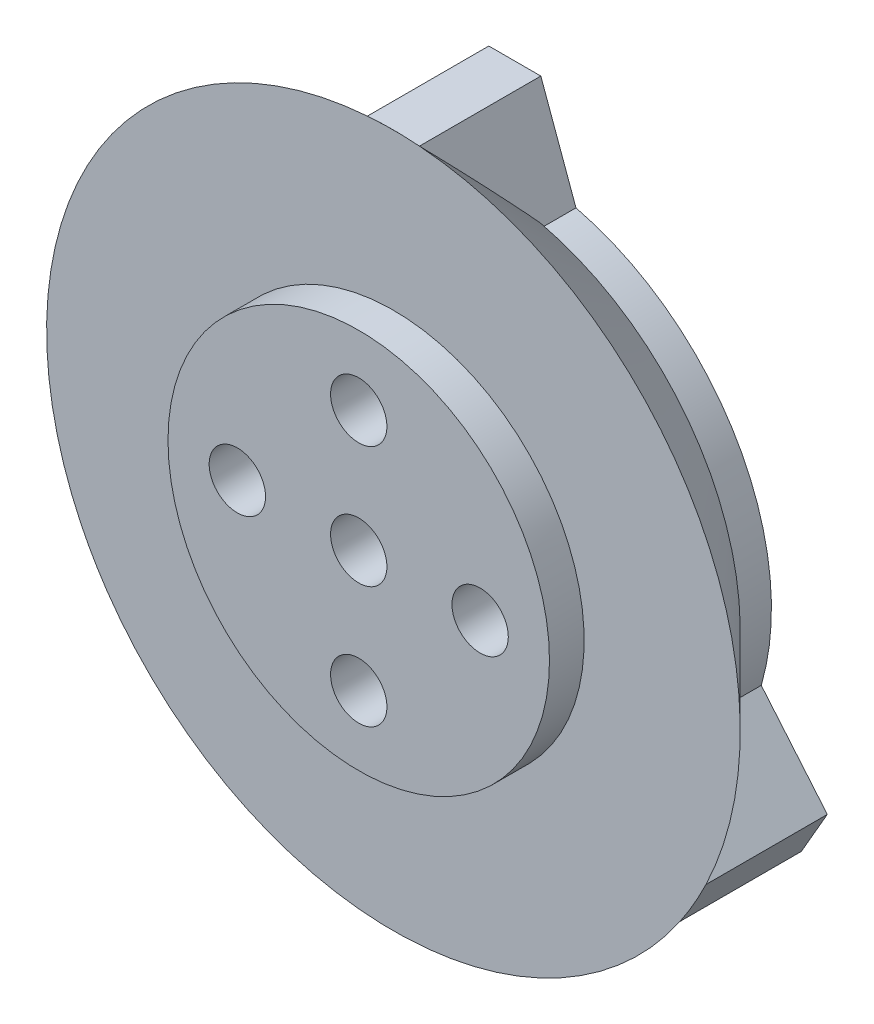
ISO-10303-21;
HEADER;
FILE_DESCRIPTION(('STEP AP214'),'2;1');
FILE_NAME('part.step','',(''),(''),'','','');
FILE_SCHEMA(('AUTOMOTIVE_DESIGN { 1 0 10303 214 1 1 1 1 }'));
ENDSEC;
DATA;
#1=APPLICATION_CONTEXT('core data for automotive mechanical design processes');
#2=APPLICATION_PROTOCOL_DEFINITION('international standard','automotive_design',2000,#1);
#3=PRODUCT_CONTEXT('',#1,'mechanical');
#4=PRODUCT('Part','Part','',(#3));
#5=PRODUCT_RELATED_PRODUCT_CATEGORY('part','',(#4));
#6=PRODUCT_DEFINITION_FORMATION('','',#4);
#7=PRODUCT_DEFINITION_CONTEXT('part definition',#1,'design');
#8=PRODUCT_DEFINITION('design','',#6,#7);
#9=PRODUCT_DEFINITION_SHAPE('','',#8);
#10=(LENGTH_UNIT() NAMED_UNIT(*) SI_UNIT(.MILLI.,.METRE.));
#11=(NAMED_UNIT(*) PLANE_ANGLE_UNIT() SI_UNIT($,.RADIAN.));
#12=(NAMED_UNIT(*) SI_UNIT($,.STERADIAN.) SOLID_ANGLE_UNIT());
#13=UNCERTAINTY_MEASURE_WITH_UNIT(LENGTH_MEASURE(1.E-05),#10,'distance_accuracy_value','');
#14=(GEOMETRIC_REPRESENTATION_CONTEXT(3) GLOBAL_UNCERTAINTY_ASSIGNED_CONTEXT((#13)) GLOBAL_UNIT_ASSIGNED_CONTEXT((#10,
#11,#12)) REPRESENTATION_CONTEXT('',''));
#15=CARTESIAN_POINT('',(0.,0.,0.));
#16=DIRECTION('',(0.,0.,1.));
#17=DIRECTION('',(1.,0.,0.));
#18=AXIS2_PLACEMENT_3D('',#15,#16,#17);
#19=CARTESIAN_POINT('',(0.,0.,-5.));
#20=DIRECTION('',(0.,0.,1.));
#21=DIRECTION('',(1.,0.,0.));
#22=AXIS2_PLACEMENT_3D('',#19,#20,#21);
#23=CONICAL_SURFACE('',#22,15.,0.785398163397448);
#24=CARTESIAN_POINT('',(0.,0.,0.));
#25=DIRECTION('',(0.,0.,1.));
#26=DIRECTION('',(1.,0.,0.));
#27=AXIS2_PLACEMENT_3D('',#24,#25,#26);
#28=CIRCLE('',#27,20.);
#29=CARTESIAN_POINT('',(-16.5217254494158,-11.2708734432663,0.));
#30=VERTEX_POINT('',#29);
#31=CARTESIAN_POINT('',(16.521725449416,-11.2708734432661,0.));
#32=VERTEX_POINT('',#31);
#33=EDGE_CURVE('E360',#30,#32,#28,.T.);
#34=ORIENTED_EDGE('',*,*,#33,.F.);
#35=CARTESIAN_POINT('',(-16.5219254494158,-11.2709087086624,0.000185091019962331));
#36=CARTESIAN_POINT('',(-16.2922122032231,-11.2304040655325,-0.212401544037627));
#37=CARTESIAN_POINT('',(-16.062163106996,-11.1898402029801,-0.424614067599164));
#38=CARTESIAN_POINT('',(-15.6013123203344,-11.1085797752109,-0.848196392483601));
#39=CARTESIAN_POINT('',(-15.3705106272494,-11.0678832095269,-1.05956619083268));
#40=CARTESIAN_POINT('',(-14.6769098007634,-10.9455826699757,-1.69222002010012));
#41=CARTESIAN_POINT('',(-14.2128632374091,-10.8637587405513,-2.11209639089741));
#42=CARTESIAN_POINT('',(-13.2806026089994,-10.6993760387104,-2.94710445182855));
#43=CARTESIAN_POINT('',(-12.8123883608847,-10.6168172340157,-3.36223593170281));
#44=CARTESIAN_POINT('',(-12.1060921392238,-10.4922781537644,-3.98030263401681));
#45=CARTESIAN_POINT('',(-11.8699845105145,-10.4506460084718,-4.1855642641485));
#46=CARTESIAN_POINT('',(-11.3962612034901,-10.367115808053,-4.59429165106725));
#47=CARTESIAN_POINT('',(-11.15864550378,-10.3252177491542,-4.79775738227759));
#48=CARTESIAN_POINT('',(-10.9201834047527,-10.2831704472193,-5.00019999999999));
#49=B_SPLINE_CURVE_WITH_KNOTS('',3,(#35,#36,#37,#38,#39,#40,#41,#42,#43,#44,#45,#46,#47,#48),
.UNSPECIFIED.,.F.,.F.,(4,2,2,2,2,2,4),(0.,0.946792412462713,1.8935881630313,3.78696649870036,
5.68042841256464,6.62726340502184,7.57411186036455),.UNSPECIFIED.);
#50=CARTESIAN_POINT('',(-10.9204190020951,-10.2832119893873,-5.));
#51=VERTEX_POINT('',#50);
#52=EDGE_CURVE('E167',#30,#51,#49,.T.);
#53=ORIENTED_EDGE('',*,*,#52,.T.);
#54=CARTESIAN_POINT('',(0.,0.,-5.));
#55=DIRECTION('',(0.,0.,1.));
#56=DIRECTION('',(1.,0.,0.));
#57=AXIS2_PLACEMENT_3D('',#54,#55,#56);
#58=CIRCLE('',#57,15.);
#59=CARTESIAN_POINT('',(10.9204190020953,-10.2832119893872,-5.));
#60=VERTEX_POINT('',#59);
#61=EDGE_CURVE('E329',#51,#60,#58,.T.);
#62=ORIENTED_EDGE('',*,*,#61,.T.);
#63=CARTESIAN_POINT('',(10.9201834047528,-10.2831704472191,-5.00019999999999));
#64=CARTESIAN_POINT('',(11.1586455037802,-10.325217749154,-4.79775738227759));
#65=CARTESIAN_POINT('',(11.3962612034902,-10.3671158080528,-4.59429165106725));
#66=CARTESIAN_POINT('',(11.8699845105146,-10.4506460084717,-4.1855642641485));
#67=CARTESIAN_POINT('',(12.1060921392239,-10.4922781537642,-3.98030263401681));
#68=CARTESIAN_POINT('',(12.8123883608849,-10.6168172340155,-3.36223593170282));
#69=CARTESIAN_POINT('',(13.2806026089995,-10.6993760387102,-2.94710445182855));
#70=CARTESIAN_POINT('',(14.2128632374093,-10.8637587405511,-2.11209639089742));
#71=CARTESIAN_POINT('',(14.6769098007636,-10.9455826699755,-1.69222002010012));
#72=CARTESIAN_POINT('',(15.3705106272495,-11.0678832095266,-1.05956619083268));
#73=CARTESIAN_POINT('',(15.6013123203346,-11.1085797752107,-0.848196392483602));
#74=CARTESIAN_POINT('',(16.0621631069962,-11.1898402029799,-0.424614067599166));
#75=CARTESIAN_POINT('',(16.2922122032232,-11.2304040655323,-0.21240154403763));
#76=CARTESIAN_POINT('',(16.521925449416,-11.2709087086622,0.000185091019959094));
#77=B_SPLINE_CURVE_WITH_KNOTS('',3,(#63,#64,#65,#66,#67,#68,#69,#70,#71,#72,#73,#74,#75,#76),
.UNSPECIFIED.,.F.,.F.,(4,2,2,2,2,2,4),(0.,0.946848455342708,1.8936834477999,3.78714536166419,
5.68052369733325,6.62731944790183,7.57411186036454),.UNSPECIFIED.);
#78=EDGE_CURVE('E57',#60,#32,#77,.T.);
#79=ORIENTED_EDGE('',*,*,#78,.T.);
#80=EDGE_LOOP('',(#34,#53,#62,#79));
#81=FACE_BOUND('',#80,.T.);
#82=ADVANCED_FACE('F41',(#81),#23,.T.);
#83=CARTESIAN_POINT('',(-18.0217254494158,-8.67279723191299,0.));
#84=VERTEX_POINT('',#83);
#85=EDGE_CURVE('E356',#84,#30,#28,.T.);
#86=ORIENTED_EDGE('',*,*,#85,.F.);
#87=CARTESIAN_POINT('',(-18.0218409194697,-8.67259723191299,1.73218339113585E-05));
#88=CARTESIAN_POINT('',(-17.7718024294517,-9.10567660047188,-0.0375471092692742));
#89=CARTESIAN_POINT('',(-17.5217639394338,-9.53875596903076,-0.0563293248208667));
#90=CARTESIAN_POINT('',(-17.0216869593979,-10.4049147061485,-0.056329324820866));
#91=CARTESIAN_POINT('',(-16.7716484693799,-10.8379940747074,-0.0375471092692727));
#92=CARTESIAN_POINT('',(-16.521609979362,-11.2710734432663,1.73218339134339E-05));
#93=B_SPLINE_CURVE_WITH_KNOTS('',3,(#87,#88,#89,#90,#91,#92),.UNSPECIFIED.,.F.,.F.,(4,2,4),(0.,
1.50128871914952,3.00257743829904),.UNSPECIFIED.);
#94=EDGE_CURVE('E47',#84,#30,#93,.T.);
#95=ORIENTED_EDGE('',*,*,#94,.T.);
#96=EDGE_LOOP('',(#86,#95));
#97=FACE_BOUND('',#96,.T.);
#98=ADVANCED_FACE('F353',(#97),#23,.T.);
#99=CARTESIAN_POINT('',(18.021725449416,-8.67279723191274,0.));
#100=VERTEX_POINT('',#99);
#101=CARTESIAN_POINT('',(1.5,19.9436706751791,0.));
#102=VERTEX_POINT('',#101);
#103=EDGE_CURVE('E328',#100,#102,#28,.T.);
#104=ORIENTED_EDGE('',*,*,#103,.F.);
#105=CARTESIAN_POINT('',(18.0218665051182,-8.67296533555267,0.0002));
#106=CARTESIAN_POINT('',(17.8719314042926,-8.4942796404878,-0.212387273925661));
#107=CARTESIAN_POINT('',(17.7217770921702,-8.31533269957234,-0.424600435124053));
#108=CARTESIAN_POINT('',(17.4209772451158,-7.95685340119349,-0.848184032275198));
#109=CARTESIAN_POINT('',(17.2703317084538,-7.77732104166831,-1.05955446525411));
#110=CARTESIAN_POINT('',(16.8176146268937,-7.23779383329031,-1.69221019277282));
#111=CARTESIAN_POINT('',(16.5147288767135,-6.87682865236753,-2.11208782185404));
#112=CARTESIAN_POINT('',(15.9062372205989,-6.15165653512935,-2.9470983788562));
#113=CARTESIAN_POINT('',(15.6006311951799,-5.78744945641774,-3.36223109651545));
#114=CARTESIAN_POINT('',(15.1396277450708,-5.23804693855198,-3.98029963232471));
#115=CARTESIAN_POINT('',(14.9855189890152,-5.05438727487253,-4.1855618698266));
#116=CARTESIAN_POINT('',(14.6763171620254,-4.68589488672068,-4.59429046173134));
#117=CARTESIAN_POINT('',(14.5212240771263,-4.50106214560574,-4.79775679055716));
#118=CARTESIAN_POINT('',(14.3655785411136,-4.31557101889136,-5.0002));
#119=B_SPLINE_CURVE_WITH_KNOTS('',3,(#105,#106,#107,#108,#109,#110,#111,#112,#113,#114,#115,
#116,#117,#118),.UNSPECIFIED.,.F.,.F.,(4,2,2,2,2,2,4),(0.,0.946795179202998,1.89359369653109,
3.78697756439935,5.68044501119241,6.62728277075473,7.57413399333534),.UNSPECIFIED.);
#120=CARTESIAN_POINT('',(14.3657323163577,-4.31575428109096,-5.));
#121=VERTEX_POINT('',#120);
#122=EDGE_CURVE('E232',#100,#121,#119,.T.);
#123=ORIENTED_EDGE('',*,*,#122,.T.);
#124=CARTESIAN_POINT('',(3.44531331426252,14.5989662704784,-5.));
#125=VERTEX_POINT('',#124);
#126=EDGE_CURVE('E317',#121,#125,#58,.T.);
#127=ORIENTED_EDGE('',*,*,#126,.T.);
#128=CARTESIAN_POINT('',(3.44539513636088,14.5987414661107,-5.0002));
#129=CARTESIAN_POINT('',(3.36257797422576,14.8262797490203,-4.79775702958947));
#130=CARTESIAN_POINT('',(3.28005476450179,15.0530104043178,-4.59429094217734));
#131=CARTESIAN_POINT('',(3.11553210176056,15.5050327051879,-4.18556283704062));
#132=CARTESIAN_POINT('',(3.03353264131286,15.7303243711754,-3.98030084489295));
#133=CARTESIAN_POINT('',(2.78823811530083,16.4042655425093,-3.36223304974531));
#134=CARTESIAN_POINT('',(2.62562873458413,16.8510311442199,-2.94710083210363));
#135=CARTESIAN_POINT('',(2.30185746232543,17.7405854038188,-2.11209128341824));
#136=CARTESIAN_POINT('',(2.14069550720726,18.1833742363811,-1.69221416263537));
#137=CARTESIAN_POINT('',(1.89981005767226,18.8452015696537,-1.05955920193722));
#138=CARTESIAN_POINT('',(1.81965333436264,19.0654303569644,-0.848189025324378));
#139=CARTESIAN_POINT('',(1.65960126338927,19.5051698079007,-0.424605942120091));
#140=CARTESIAN_POINT('',(1.57970591480499,19.7246804740555,-0.212393038502483));
#141=CARTESIAN_POINT('',(1.49992720595315,19.9438706751791,0.000193977345028846));
#142=B_SPLINE_CURVE_WITH_KNOTS('',3,(#128,#129,#130,#131,#132,#133,#134,#135,#136,#137,#138,
#139,#140,#141),.UNSPECIFIED.,.F.,.F.,(4,2,2,2,2,2,4),(0.,0.94685010472287,1.89368674648109,
3.78715195818361,5.68053359125606,6.62733099091967,7.57412505246595),.UNSPECIFIED.);
#143=EDGE_CURVE('E287',#125,#102,#142,.T.);
#144=ORIENTED_EDGE('',*,*,#143,.T.);
#145=EDGE_LOOP('',(#104,#123,#127,#144));
#146=FACE_BOUND('',#145,.T.);
#147=ADVANCED_FACE('F409',(#146),#23,.T.);
#148=EDGE_CURVE('E368',#32,#100,#28,.T.);
#149=ORIENTED_EDGE('',*,*,#148,.F.);
#150=CARTESIAN_POINT('',(16.5216099793621,-11.2710734432661,1.73218339080578E-05));
#151=CARTESIAN_POINT('',(16.7716484693801,-10.8379940747072,-0.0375471092692766));
#152=CARTESIAN_POINT('',(17.021686959398,-10.4049147061483,-0.056329324820869));
#153=CARTESIAN_POINT('',(17.5217639394339,-9.53875596903052,-0.0563293248208692));
#154=CARTESIAN_POINT('',(17.7718024294519,-9.10567660047163,-0.037547109269277));
#155=CARTESIAN_POINT('',(18.0218409194698,-8.67259723191274,1.73218339075068E-05));
#156=B_SPLINE_CURVE_WITH_KNOTS('',3,(#150,#151,#152,#153,#154,#155),.UNSPECIFIED.,.F.,.F.,(4,2,
4),(0.,1.50128871914952,3.00257743829903),.UNSPECIFIED.);
#157=EDGE_CURVE('E341',#32,#100,#156,.T.);
#158=ORIENTED_EDGE('',*,*,#157,.T.);
#159=EDGE_LOOP('',(#149,#158));
#160=FACE_BOUND('',#159,.T.);
#161=ADVANCED_FACE('F415',(#160),#23,.T.);
#162=CARTESIAN_POINT('',(0.,0.,-7.));
#163=DIRECTION('',(0.,0.,1.));
#164=DIRECTION('',(1.,0.,0.));
#165=AXIS2_PLACEMENT_3D('',#162,#163,#164);
#166=CYLINDRICAL_SURFACE('',#165,14.8);
#167=DIRECTION('',(0.,0.,1.));
#168=VECTOR('',#167,1.);
#169=CARTESIAN_POINT('',(-10.6841325424947,-10.2415483113837,-17.2374025664844));
#170=LINE('',#169,#168);
#171=CARTESIAN_POINT('',(-10.6841325424947,-10.2415483113837,-7.));
#172=VERTEX_POINT('',#171);
#173=CARTESIAN_POINT('',(-10.6841325424947,-10.2415483113837,-5.));
#174=VERTEX_POINT('',#173);
#175=EDGE_CURVE('E159',#172,#174,#170,.T.);
#176=ORIENTED_EDGE('',*,*,#175,.F.);
#177=CARTESIAN_POINT('',(0.,0.,-7.));
#178=DIRECTION('',(0.,0.,-1.));
#179=DIRECTION('',(-1.,0.,0.));
#180=AXIS2_PLACEMENT_3D('',#177,#178,#179);
#181=CIRCLE('',#180,14.8);
#182=CARTESIAN_POINT('',(10.6841325424948,-10.2415483113835,-7.));
#183=VERTEX_POINT('',#182);
#184=EDGE_CURVE('E160',#183,#172,#181,.T.);
#185=ORIENTED_EDGE('',*,*,#184,.F.);
#186=DIRECTION('',(0.,0.,1.));
#187=VECTOR('',#186,1.);
#188=CARTESIAN_POINT('',(10.6841325424948,-10.2415483113835,-17.2374025664844));
#189=LINE('',#188,#187);
#190=CARTESIAN_POINT('',(10.6841325424948,-10.2415483113835,-5.));
#191=VERTEX_POINT('',#190);
#192=EDGE_CURVE('E198',#183,#191,#189,.T.);
#193=ORIENTED_EDGE('',*,*,#192,.T.);
#194=CARTESIAN_POINT('',(0.,0.,-5.));
#195=DIRECTION('',(0.,0.,-1.));
#196=DIRECTION('',(-1.,0.,0.));
#197=AXIS2_PLACEMENT_3D('',#194,#195,#196);
#198=CIRCLE('',#197,14.8);
#199=EDGE_CURVE('E322',#191,#174,#198,.T.);
#200=ORIENTED_EDGE('',*,*,#199,.T.);
#201=EDGE_LOOP('',(#176,#185,#193,#200));
#202=FACE_BOUND('',#201,.T.);
#203=ADVANCED_FACE('F398',(#202),#166,.T.);
#204=DIRECTION('',(0.,0.,1.));
#205=VECTOR('',#204,1.);
#206=CARTESIAN_POINT('',(14.2115072829913,-4.1319560435085,-17.2374025664844));
#207=LINE('',#206,#205);
#208=CARTESIAN_POINT('',(14.2115072829913,-4.1319560435085,-7.));
#209=VERTEX_POINT('',#208);
#210=CARTESIAN_POINT('',(14.2115072829913,-4.1319560435085,-5.));
#211=VERTEX_POINT('',#210);
#212=EDGE_CURVE('E200',#209,#211,#207,.T.);
#213=ORIENTED_EDGE('',*,*,#212,.F.);
#214=CARTESIAN_POINT('',(3.5273747404965,14.3735043548923,-7.));
#215=VERTEX_POINT('',#214);
#216=EDGE_CURVE('E320',#215,#209,#181,.T.);
#217=ORIENTED_EDGE('',*,*,#216,.F.);
#218=DIRECTION('',(0.,0.,1.));
#219=VECTOR('',#218,1.);
#220=CARTESIAN_POINT('',(3.5273747404965,14.3735043548923,-15.9886730430709));
#221=LINE('',#220,#219);
#222=CARTESIAN_POINT('',(3.5273747404965,14.3735043548923,-5.));
#223=VERTEX_POINT('',#222);
#224=EDGE_CURVE('E271',#215,#223,#221,.T.);
#225=ORIENTED_EDGE('',*,*,#224,.T.);
#226=EDGE_CURVE('E319',#223,#211,#198,.T.);
#227=ORIENTED_EDGE('',*,*,#226,.T.);
#228=EDGE_LOOP('',(#213,#217,#225,#227));
#229=FACE_BOUND('',#228,.T.);
#230=ADVANCED_FACE('F394',(#229),#166,.T.);
#231=CARTESIAN_POINT('',(0.,15.,-5.));
#232=DIRECTION('',(0.,0.,1.));
#233=DIRECTION('',(1.,0.,0.));
#234=AXIS2_PLACEMENT_3D('',#231,#232,#233);
#235=PLANE('',#234);
#236=ORIENTED_EDGE('',*,*,#61,.F.);
#237=DIRECTION('',(0.984807753012207,0.173648177666938,0.));
#238=VECTOR('',#237,1.);
#239=CARTESIAN_POINT('',(3.99439296920386,-7.6533282266536,-5.));
#240=LINE('',#239,#238);
#241=EDGE_CURVE('E247',#51,#174,#240,.T.);
#242=ORIENTED_EDGE('',*,*,#241,.T.);
#243=ORIENTED_EDGE('',*,*,#199,.F.);
#244=DIRECTION('',(0.984807753012209,-0.173648177666924,0.));
#245=VECTOR('',#244,1.);
#246=CARTESIAN_POINT('',(-3.99439296920355,-7.65332822665369,-5.));
#247=LINE('',#246,#245);
#248=EDGE_CURVE('E190',#191,#60,#247,.T.);
#249=ORIENTED_EDGE('',*,*,#248,.T.);
#250=EDGE_LOOP('',(#236,#242,#243,#249));
#251=FACE_BOUND('',#250,.T.);
#252=ADVANCED_FACE('F405',(#251),#235,.F.);
#253=ORIENTED_EDGE('',*,*,#126,.F.);
#254=DIRECTION('',(-0.642787609686549,0.76604444311897,0.));
#255=VECTOR('',#254,1.);
#256=CARTESIAN_POINT('',(-1.08099450867669,14.0929379064647,-5.));
#257=LINE('',#256,#255);
#258=EDGE_CURVE('E215',#121,#211,#257,.T.);
#259=ORIENTED_EDGE('',*,*,#258,.T.);
#260=ORIENTED_EDGE('',*,*,#226,.F.);
#261=DIRECTION('',(-0.342020143325666,0.93969262078591,0.));
#262=VECTOR('',#261,1.);
#263=CARTESIAN_POINT('',(2.91339846052714,16.0603903201888,-5.));
#264=LINE('',#263,#262);
#265=EDGE_CURVE('E283',#223,#125,#264,.T.);
#266=ORIENTED_EDGE('',*,*,#265,.T.);
#267=EDGE_LOOP('',(#253,#259,#260,#266));
#268=FACE_BOUND('',#267,.T.);
#269=ADVANCED_FACE('F408',(#268),#235,.F.);
#270=CARTESIAN_POINT('',(-3.44531331426252,14.5989662704784,-5.));
#271=VERTEX_POINT('',#270);
#272=CARTESIAN_POINT('',(-14.3657323163577,-4.31575428109116,-5.));
#273=VERTEX_POINT('',#272);
#274=EDGE_CURVE('E326',#271,#273,#58,.T.);
#275=ORIENTED_EDGE('',*,*,#274,.T.);
#276=CARTESIAN_POINT('',(-14.3655785411136,-4.31557101889156,-5.0002));
#277=CARTESIAN_POINT('',(-14.5212240771263,-4.50106214560594,-4.79775679055716));
#278=CARTESIAN_POINT('',(-14.6763171620253,-4.68589488672088,-4.59429046173134));
#279=CARTESIAN_POINT('',(-14.9855189890152,-5.05438727487274,-4.1855618698266));
#280=CARTESIAN_POINT('',(-15.1396277450707,-5.23804693855218,-3.98029963232471));
#281=CARTESIAN_POINT('',(-15.6006311951798,-5.78744945641795,-3.36223109651545));
#282=CARTESIAN_POINT('',(-15.9062372205988,-6.15165653512956,-2.9470983788562));
#283=CARTESIAN_POINT('',(-16.5147288767134,-6.87682865236775,-2.11208782185404));
#284=CARTESIAN_POINT('',(-16.8176146268936,-7.23779383329054,-1.69221019277282));
#285=CARTESIAN_POINT('',(-17.2703317084537,-7.77732104166855,-1.05955446525411));
#286=CARTESIAN_POINT('',(-17.4209772451157,-7.95685340119373,-0.848184032275199));
#287=CARTESIAN_POINT('',(-17.7217770921701,-8.31533269957259,-0.424600435124056));
#288=CARTESIAN_POINT('',(-17.8719314042925,-8.49427964048805,-0.212387273925664));
#289=CARTESIAN_POINT('',(-18.0218665051181,-8.67296533555291,0.000199999999999724));
#290=B_SPLINE_CURVE_WITH_KNOTS('',3,(#276,#277,#278,#279,#280,#281,#282,#283,#284,#285,#286,
#287,#288,#289),.UNSPECIFIED.,.F.,.F.,(4,2,2,2,2,2,4),(0.,0.946851222580607,1.89368898214293,
3.78715642893598,5.68054029680424,6.62733881413233,7.57413399333533),.UNSPECIFIED.);
#291=EDGE_CURVE('E63',#273,#84,#290,.T.);
#292=ORIENTED_EDGE('',*,*,#291,.T.);
#293=CARTESIAN_POINT('',(-1.5,19.9436706751791,0.));
#294=VERTEX_POINT('',#293);
#295=EDGE_CURVE('E331',#294,#84,#28,.T.);
#296=ORIENTED_EDGE('',*,*,#295,.F.);
#297=CARTESIAN_POINT('',(-1.49992720595315,19.9438706751791,0.000193977345030234));
#298=CARTESIAN_POINT('',(-1.57970591480499,19.7246804740555,-0.212393038502483));
#299=CARTESIAN_POINT('',(-1.65960126338927,19.5051698079007,-0.424605942120089));
#300=CARTESIAN_POINT('',(-1.81965333436264,19.0654303569644,-0.848189025324375));
#301=CARTESIAN_POINT('',(-1.89981005767226,18.8452015696537,-1.05955920193722));
#302=CARTESIAN_POINT('',(-2.14069550720726,18.1833742363811,-1.69221416263537));
#303=CARTESIAN_POINT('',(-2.30185746232543,17.7405854038188,-2.11209128341823));
#304=CARTESIAN_POINT('',(-2.62562873458413,16.8510311442199,-2.94710083210363));
#305=CARTESIAN_POINT('',(-2.78823811530083,16.4042655425093,-3.36223304974531));
#306=CARTESIAN_POINT('',(-3.03353264131286,15.7303243711754,-3.98030084489294));
#307=CARTESIAN_POINT('',(-3.11553210176056,15.5050327051879,-4.18556283704062));
#308=CARTESIAN_POINT('',(-3.28005476450179,15.0530104043178,-4.59429094217734));
#309=CARTESIAN_POINT('',(-3.36257797422576,14.8262797490203,-4.79775702958947));
#310=CARTESIAN_POINT('',(-3.44539513636088,14.5987414661107,-5.0002));
#311=B_SPLINE_CURVE_WITH_KNOTS('',3,(#297,#298,#299,#300,#301,#302,#303,#304,#305,#306,#307,
#308,#309,#310),.UNSPECIFIED.,.F.,.F.,(4,2,2,2,2,2,4),(0.,0.946794061546281,1.89359146120989,
3.78697309428233,5.68043830598486,6.62727494774308,7.57412505246595),.UNSPECIFIED.);
#312=EDGE_CURVE('E310',#294,#271,#311,.T.);
#313=ORIENTED_EDGE('',*,*,#312,.T.);
#314=EDGE_LOOP('',(#275,#292,#296,#313));
#315=FACE_BOUND('',#314,.T.);
#316=ADVANCED_FACE('F367',(#315),#23,.T.);
#317=CARTESIAN_POINT('',(-14.2115072829912,-4.1319560435087,-7.));
#318=VERTEX_POINT('',#317);
#319=CARTESIAN_POINT('',(-3.5273747404965,14.3735043548923,-7.));
#320=VERTEX_POINT('',#319);
#321=EDGE_CURVE('E316',#318,#320,#181,.T.);
#322=ORIENTED_EDGE('',*,*,#321,.F.);
#323=DIRECTION('',(0.,0.,1.));
#324=VECTOR('',#323,1.);
#325=CARTESIAN_POINT('',(-14.2115072829912,-4.1319560435087,-17.2374025664844));
#326=LINE('',#325,#324);
#327=CARTESIAN_POINT('',(-14.2115072829912,-4.1319560435087,-5.));
#328=VERTEX_POINT('',#327);
#329=EDGE_CURVE('E185',#318,#328,#326,.T.);
#330=ORIENTED_EDGE('',*,*,#329,.T.);
#331=CARTESIAN_POINT('',(-3.5273747404965,14.3735043548923,-5.));
#332=VERTEX_POINT('',#331);
#333=EDGE_CURVE('E324',#328,#332,#198,.T.);
#334=ORIENTED_EDGE('',*,*,#333,.T.);
#335=DIRECTION('',(0.,0.,1.));
#336=VECTOR('',#335,1.);
#337=CARTESIAN_POINT('',(-3.5273747404965,14.3735043548923,-15.9886730430709));
#338=LINE('',#337,#336);
#339=EDGE_CURVE('E274',#320,#332,#338,.T.);
#340=ORIENTED_EDGE('',*,*,#339,.F.);
#341=EDGE_LOOP('',(#322,#330,#334,#340));
#342=FACE_BOUND('',#341,.T.);
#343=ADVANCED_FACE('F377',(#342),#166,.T.);
#344=CARTESIAN_POINT('',(0.,0.,0.));
#345=DIRECTION('',(0.,0.,-1.));
#346=DIRECTION('',(-1.,0.,0.));
#347=AXIS2_PLACEMENT_3D('',#344,#345,#346);
#348=PLANE('',#347);
#349=CARTESIAN_POINT('',(0.,0.,0.));
#350=DIRECTION('',(0.,0.,-1.));
#351=DIRECTION('',(-1.,0.,0.));
#352=AXIS2_PLACEMENT_3D('',#349,#350,#351);
#353=CIRCLE('',#352,11.);
#354=CARTESIAN_POINT('',(-11.,0.,0.));
#355=VERTEX_POINT('',#354);
#356=EDGE_CURVE('E11',#355,#355,#353,.F.);
#357=ORIENTED_EDGE('',*,*,#356,.F.);
#358=EDGE_LOOP('',(#357));
#359=FACE_BOUND('',#358,.T.);
#360=ORIENTED_EDGE('',*,*,#295,.T.);
#361=ORIENTED_EDGE('',*,*,#85,.T.);
#362=ORIENTED_EDGE('',*,*,#33,.T.);
#363=ORIENTED_EDGE('',*,*,#148,.T.);
#364=ORIENTED_EDGE('',*,*,#103,.T.);
#365=EDGE_CURVE('E332',#102,#294,#28,.T.);
#366=ORIENTED_EDGE('',*,*,#365,.T.);
#367=EDGE_LOOP('',(#360,#361,#362,#363,#364,#366));
#368=FACE_BOUND('',#367,.T.);
#369=ADVANCED_FACE('F43',(#359,#368),#348,.F.);
#370=ORIENTED_EDGE('',*,*,#365,.F.);
#371=CARTESIAN_POINT('',(7.3311518948453,19.9436706751791,1.24843025038071));
#372=CARTESIAN_POINT('',(7.02012300250821,19.9436706751791,1.14111315045642));
#373=CARTESIAN_POINT('',(6.70720045733248,19.9436706751791,1.03916948911886));
#374=CARTESIAN_POINT('',(6.0776728230892,19.9436706751791,0.847021371662871));
#375=CARTESIAN_POINT('',(5.76106663512195,19.9436706751791,0.756820521823966));
#376=CARTESIAN_POINT('',(5.12385814209701,19.9436706751791,0.589056987972592));
#377=CARTESIAN_POINT('',(4.80324934881012,19.9436706751791,0.511518821588938));
#378=CARTESIAN_POINT('',(4.15901744497874,19.9436706751791,0.370289187332219));
#379=CARTESIAN_POINT('',(3.83539463346608,19.9436706751791,0.306596360756996));
#380=CARTESIAN_POINT('',(3.19574465777905,19.9436706751791,0.195709984367746));
#381=CARTESIAN_POINT('',(2.87979637994317,19.9436706751791,0.148062821762219));
#382=CARTESIAN_POINT('',(2.2460504403553,19.9436706751791,0.0672863079450478));
#383=CARTESIAN_POINT('',(1.92825283504412,19.9436706751791,0.0341565159987449));
#384=CARTESIAN_POINT('',(1.29175644188521,19.9436706751791,-0.0170544272025744));
#385=CARTESIAN_POINT('',(0.97305884491154,19.9436706751791,-0.0351503189006851));
#386=CARTESIAN_POINT('',(0.335167336527585,19.9436706751791,-0.0560604769443153));
#387=CARTESIAN_POINT('',(0.0159734375351571,19.9436706751791,-0.0588751196741401));
#388=CARTESIAN_POINT('',(-0.597702874407371,19.9436706751791,-0.0495492152914187));
#389=CARTESIAN_POINT('',(-0.892202784474297,19.9436706751791,-0.0385392276567103));
#390=CARTESIAN_POINT('',(-1.480443533562,19.9436706751791,-0.00361485272645378));
#391=CARTESIAN_POINT('',(-1.77418430792805,19.9436706751791,0.0203005995371653));
#392=CARTESIAN_POINT('',(-2.65386253833873,19.9436706751791,0.11102115733292));
#393=CARTESIAN_POINT('',(-3.23792842257963,19.9436706751791,0.196794960567576));
#394=CARTESIAN_POINT('',(-4.41454813037195,19.9436706751791,0.417981661655459));
#395=CARTESIAN_POINT('',(-5.00683270732983,19.9436706751791,0.554803558073947));
#396=CARTESIAN_POINT('',(-5.88588035398762,19.9436706751791,0.792162096003921));
#397=CARTESIAN_POINT('',(-6.1771232452884,19.9436706751791,0.87656237888053));
#398=CARTESIAN_POINT('',(-6.75648369791574,19.9436706751791,1.05526549129477));
#399=CARTESIAN_POINT('',(-7.0446019843227,19.9436706751791,1.14956596673845));
#400=CARTESIAN_POINT('',(-7.3311518948453,19.9436706751791,1.24843025038071));
#401=B_SPLINE_CURVE_WITH_KNOTS('',3,(#371,#372,#373,#374,#375,#376,#377,#378,#379,#380,#381,
#382,#383,#384,#385,#386,#387,#388,#389,#390,#391,#392,#393,#394,#395,#396,#397,#398,#399,#400),
.UNSPECIFIED.,.F.,.F.,(4,2,2,2,2,2,2,2,2,2,2,2,2,2,4),(0.,0.987074558043661,1.97445154038281,
2.96371819024268,3.95288771528242,4.9111290646383,5.86934132061024,6.8266129558319,
7.78386101289874,8.66768454193705,9.55158101587383,11.3203531504012,13.1420700820563,
14.0515978387341,14.9609098132389),.UNSPECIFIED.);
#402=EDGE_CURVE('E323',#102,#294,#401,.T.);
#403=ORIENTED_EDGE('',*,*,#402,.T.);
#404=EDGE_LOOP('',(#370,#403));
#405=FACE_BOUND('',#404,.T.);
#406=ADVANCED_FACE('F212',(#405),#23,.T.);
#407=ORIENTED_EDGE('',*,*,#333,.F.);
#408=DIRECTION('',(-0.642787609686538,-0.766044443118979,0.));
#409=VECTOR('',#408,1.);
#410=CARTESIAN_POINT('',(1.08099450867657,14.0929379064648,-5.));
#411=LINE('',#410,#409);
#412=EDGE_CURVE('E239',#328,#273,#411,.T.);
#413=ORIENTED_EDGE('',*,*,#412,.T.);
#414=ORIENTED_EDGE('',*,*,#274,.F.);
#415=DIRECTION('',(-0.342020143325666,-0.93969262078591,0.));
#416=VECTOR('',#415,1.);
#417=CARTESIAN_POINT('',(-2.91339846052714,16.0603903201888,-5.));
#418=LINE('',#417,#416);
#419=EDGE_CURVE('E294',#271,#332,#418,.T.);
#420=ORIENTED_EDGE('',*,*,#419,.T.);
#421=EDGE_LOOP('',(#407,#413,#414,#420));
#422=FACE_BOUND('',#421,.T.);
#423=ADVANCED_FACE('F374',(#422),#235,.F.);
#424=CARTESIAN_POINT('',(0.,0.,-7.));
#425=DIRECTION('',(0.,0.,-1.));
#426=DIRECTION('',(-1.,0.,0.));
#427=AXIS2_PLACEMENT_3D('',#424,#425,#426);
#428=PLANE('',#427);
#429=CARTESIAN_POINT('',(0.,7.,-7.));
#430=DIRECTION('',(0.,0.,1.));
#431=DIRECTION('',(1.,0.,0.));
#432=AXIS2_PLACEMENT_3D('',#429,#430,#431);
#433=CIRCLE('',#432,1.625);
#434=CARTESIAN_POINT('',(1.625,7.,-7.));
#435=VERTEX_POINT('',#434);
#436=EDGE_CURVE('E194',#435,#435,#433,.T.);
#437=ORIENTED_EDGE('',*,*,#436,.T.);
#438=EDGE_LOOP('',(#437));
#439=FACE_BOUND('',#438,.T.);
#440=CARTESIAN_POINT('',(-7.,0.,-7.));
#441=DIRECTION('',(0.,0.,1.));
#442=DIRECTION('',(1.,0.,0.));
#443=AXIS2_PLACEMENT_3D('',#440,#441,#442);
#444=CIRCLE('',#443,1.625);
#445=CARTESIAN_POINT('',(-5.375,0.,-7.));
#446=VERTEX_POINT('',#445);
#447=EDGE_CURVE('E488',#446,#446,#444,.T.);
#448=ORIENTED_EDGE('',*,*,#447,.T.);
#449=EDGE_LOOP('',(#448));
#450=FACE_BOUND('',#449,.T.);
#451=CARTESIAN_POINT('',(0.,-7.,-7.));
#452=DIRECTION('',(0.,0.,1.));
#453=DIRECTION('',(1.,0.,0.));
#454=AXIS2_PLACEMENT_3D('',#451,#452,#453);
#455=CIRCLE('',#454,1.625);
#456=CARTESIAN_POINT('',(1.62499999999995,-7.,-7.));
#457=VERTEX_POINT('',#456);
#458=EDGE_CURVE('E491',#457,#457,#455,.T.);
#459=ORIENTED_EDGE('',*,*,#458,.T.);
#460=EDGE_LOOP('',(#459));
#461=FACE_BOUND('',#460,.T.);
#462=CARTESIAN_POINT('',(7.,0.,-7.));
#463=DIRECTION('',(0.,0.,1.));
#464=DIRECTION('',(1.,0.,0.));
#465=AXIS2_PLACEMENT_3D('',#462,#463,#464);
#466=CIRCLE('',#465,1.625);
#467=CARTESIAN_POINT('',(8.625,0.,-7.));
#468=VERTEX_POINT('',#467);
#469=EDGE_CURVE('E178',#468,#468,#466,.T.);
#470=ORIENTED_EDGE('',*,*,#469,.T.);
#471=EDGE_LOOP('',(#470));
#472=FACE_BOUND('',#471,.T.);
#473=CARTESIAN_POINT('',(0.,0.,-7.));
#474=DIRECTION('',(0.,0.,1.));
#475=DIRECTION('',(1.,0.,0.));
#476=AXIS2_PLACEMENT_3D('',#473,#474,#475);
#477=CIRCLE('',#476,1.625);
#478=CARTESIAN_POINT('',(1.625,0.,-7.));
#479=VERTEX_POINT('',#478);
#480=EDGE_CURVE('E467',#479,#479,#477,.T.);
#481=ORIENTED_EDGE('',*,*,#480,.T.);
#482=EDGE_LOOP('',(#481));
#483=FACE_BOUND('',#482,.T.);
#484=ORIENTED_EDGE('',*,*,#216,.T.);
#485=DIRECTION('',(-0.642787609686549,0.76604444311897,0.));
#486=VECTOR('',#485,1.);
#487=CARTESIAN_POINT('',(18.021725449416,-8.67279723191274,-7.));
#488=LINE('',#487,#486);
#489=CARTESIAN_POINT('',(18.021725449416,-8.67279723191274,-7.));
#490=VERTEX_POINT('',#489);
#491=EDGE_CURVE('E197',#490,#209,#488,.T.);
#492=ORIENTED_EDGE('',*,*,#491,.F.);
#493=DIRECTION('',(0.499999999999992,0.866025403784443,0.));
#494=VECTOR('',#493,1.);
#495=CARTESIAN_POINT('',(16.521725449416,-11.2708734432661,-7.));
#496=LINE('',#495,#494);
#497=CARTESIAN_POINT('',(16.521725449416,-11.2708734432661,-7.));
#498=VERTEX_POINT('',#497);
#499=EDGE_CURVE('E188',#498,#490,#496,.T.);
#500=ORIENTED_EDGE('',*,*,#499,.F.);
#501=DIRECTION('',(0.984807753012209,-0.173648177666924,0.));
#502=VECTOR('',#501,1.);
#503=CARTESIAN_POINT('',(16.521725449416,-11.2708734432661,-7.));
#504=LINE('',#503,#502);
#505=EDGE_CURVE('E172',#183,#498,#504,.T.);
#506=ORIENTED_EDGE('',*,*,#505,.F.);
#507=ORIENTED_EDGE('',*,*,#184,.T.);
#508=DIRECTION('',(0.984807753012207,0.173648177666938,0.));
#509=VECTOR('',#508,1.);
#510=CARTESIAN_POINT('',(-16.5217254494158,-11.2708734432663,-7.));
#511=LINE('',#510,#509);
#512=CARTESIAN_POINT('',(-16.5217254494158,-11.2708734432663,-7.));
#513=VERTEX_POINT('',#512);
#514=EDGE_CURVE('E149',#513,#172,#511,.T.);
#515=ORIENTED_EDGE('',*,*,#514,.F.);
#516=DIRECTION('',(0.500000000000004,-0.866025403784436,0.));
#517=VECTOR('',#516,1.);
#518=CARTESIAN_POINT('',(-18.0217254494158,-8.67279723191299,-7.));
#519=LINE('',#518,#517);
#520=CARTESIAN_POINT('',(-18.0217254494158,-8.67279723191299,-7.));
#521=VERTEX_POINT('',#520);
#522=EDGE_CURVE('E152',#521,#513,#519,.T.);
#523=ORIENTED_EDGE('',*,*,#522,.F.);
#524=DIRECTION('',(-0.642787609686538,-0.766044443118979,0.));
#525=VECTOR('',#524,1.);
#526=CARTESIAN_POINT('',(-18.0217254494158,-8.67279723191299,-7.));
#527=LINE('',#526,#525);
#528=EDGE_CURVE('E182',#318,#521,#527,.T.);
#529=ORIENTED_EDGE('',*,*,#528,.F.);
#530=ORIENTED_EDGE('',*,*,#321,.T.);
#531=DIRECTION('',(-0.342020143325666,-0.93969262078591,0.));
#532=VECTOR('',#531,1.);
#533=CARTESIAN_POINT('',(-1.5,19.9436706751791,-7.));
#534=LINE('',#533,#532);
#535=CARTESIAN_POINT('',(-1.5,19.9436706751791,-7.));
#536=VERTEX_POINT('',#535);
#537=EDGE_CURVE('E275',#536,#320,#534,.T.);
#538=ORIENTED_EDGE('',*,*,#537,.F.);
#539=DIRECTION('',(-1.,0.,0.));
#540=VECTOR('',#539,1.);
#541=CARTESIAN_POINT('',(1.5,19.9436706751791,-7.));
#542=LINE('',#541,#540);
#543=CARTESIAN_POINT('',(1.5,19.9436706751791,-7.));
#544=VERTEX_POINT('',#543);
#545=EDGE_CURVE('E263',#544,#536,#542,.T.);
#546=ORIENTED_EDGE('',*,*,#545,.F.);
#547=DIRECTION('',(-0.342020143325666,0.93969262078591,0.));
#548=VECTOR('',#547,1.);
#549=CARTESIAN_POINT('',(1.5,19.9436706751791,-7.));
#550=LINE('',#549,#548);
#551=EDGE_CURVE('E270',#215,#544,#550,.T.);
#552=ORIENTED_EDGE('',*,*,#551,.F.);
#553=EDGE_LOOP('',(#484,#492,#500,#506,#507,#515,#523,#529,#530,#538,#546,#552));
#554=FACE_BOUND('',#553,.T.);
#555=ADVANCED_FACE('F155',(#439,#450,#461,#472,#483,#554),#428,.T.);
#556=CARTESIAN_POINT('',(1.5,19.9436706751791,-15.9886730430709));
#557=DIRECTION('',(0.,1.,0.));
#558=DIRECTION('',(0.,0.,1.));
#559=AXIS2_PLACEMENT_3D('',#556,#557,#558);
#560=PLANE('',#559);
#561=ORIENTED_EDGE('',*,*,#402,.F.);
#562=DIRECTION('',(0.,0.,1.));
#563=VECTOR('',#562,1.);
#564=CARTESIAN_POINT('',(1.5,19.9436706751791,-15.9886730430709));
#565=LINE('',#564,#563);
#566=EDGE_CURVE('E269',#544,#102,#565,.T.);
#567=ORIENTED_EDGE('',*,*,#566,.F.);
#568=ORIENTED_EDGE('',*,*,#545,.T.);
#569=DIRECTION('',(0.,0.,1.));
#570=VECTOR('',#569,1.);
#571=CARTESIAN_POINT('',(-1.5,19.9436706751791,-15.9886730430709));
#572=LINE('',#571,#570);
#573=EDGE_CURVE('E266',#536,#294,#572,.T.);
#574=ORIENTED_EDGE('',*,*,#573,.T.);
#575=EDGE_LOOP('',(#561,#567,#568,#574));
#576=FACE_BOUND('',#575,.T.);
#577=ADVANCED_FACE('F305',(#576),#560,.T.);
#578=CARTESIAN_POINT('',(-1.5,19.9436706751791,-15.9886730430709));
#579=DIRECTION('',(-0.939692620785909,0.342020143325666,0.));
#580=DIRECTION('',(-0.342020143325666,-0.93969262078591,0.));
#581=AXIS2_PLACEMENT_3D('',#578,#579,#580);
#582=PLANE('',#581);
#583=ORIENTED_EDGE('',*,*,#312,.F.);
#584=ORIENTED_EDGE('',*,*,#573,.F.);
#585=ORIENTED_EDGE('',*,*,#537,.T.);
#586=ORIENTED_EDGE('',*,*,#339,.T.);
#587=ORIENTED_EDGE('',*,*,#419,.F.);
#588=EDGE_LOOP('',(#583,#584,#585,#586,#587));
#589=FACE_BOUND('',#588,.T.);
#590=ADVANCED_FACE('F297',(#589),#582,.T.);
#591=CARTESIAN_POINT('',(1.5,19.9436706751791,-15.9886730430709));
#592=DIRECTION('',(0.939692620785909,0.342020143325666,0.));
#593=DIRECTION('',(-0.342020143325666,0.93969262078591,0.));
#594=AXIS2_PLACEMENT_3D('',#591,#592,#593);
#595=PLANE('',#594);
#596=ORIENTED_EDGE('',*,*,#143,.F.);
#597=ORIENTED_EDGE('',*,*,#265,.F.);
#598=ORIENTED_EDGE('',*,*,#224,.F.);
#599=ORIENTED_EDGE('',*,*,#551,.T.);
#600=ORIENTED_EDGE('',*,*,#566,.T.);
#601=EDGE_LOOP('',(#596,#597,#598,#599,#600));
#602=FACE_BOUND('',#601,.T.);
#603=ADVANCED_FACE('F299',(#602),#595,.T.);
#604=CARTESIAN_POINT('',(16.521725449416,-11.2708734432661,-17.2374025664844));
#605=DIRECTION('',(0.866025403784443,-0.499999999999992,0.));
#606=DIRECTION('',(0.499999999999992,0.866025403784443,0.));
#607=AXIS2_PLACEMENT_3D('',#604,#605,#606);
#608=PLANE('',#607);
#609=ORIENTED_EDGE('',*,*,#157,.F.);
#610=DIRECTION('',(0.,0.,1.));
#611=VECTOR('',#610,1.);
#612=CARTESIAN_POINT('',(16.521725449416,-11.2708734432661,-17.2374025664844));
#613=LINE('',#612,#611);
#614=EDGE_CURVE('E175',#498,#32,#613,.T.);
#615=ORIENTED_EDGE('',*,*,#614,.F.);
#616=ORIENTED_EDGE('',*,*,#499,.T.);
#617=DIRECTION('',(0.,0.,1.));
#618=VECTOR('',#617,1.);
#619=CARTESIAN_POINT('',(18.021725449416,-8.67279723191274,-17.2374025664844));
#620=LINE('',#619,#618);
#621=EDGE_CURVE('E192',#490,#100,#620,.T.);
#622=ORIENTED_EDGE('',*,*,#621,.T.);
#623=EDGE_LOOP('',(#609,#615,#616,#622));
#624=FACE_BOUND('',#623,.T.);
#625=ADVANCED_FACE('F230',(#624),#608,.T.);
#626=CARTESIAN_POINT('',(18.021725449416,-8.67279723191274,-17.2374025664844));
#627=DIRECTION('',(0.76604444311897,0.642787609686549,0.));
#628=DIRECTION('',(-0.642787609686549,0.76604444311897,0.));
#629=AXIS2_PLACEMENT_3D('',#626,#627,#628);
#630=PLANE('',#629);
#631=ORIENTED_EDGE('',*,*,#122,.F.);
#632=ORIENTED_EDGE('',*,*,#621,.F.);
#633=ORIENTED_EDGE('',*,*,#491,.T.);
#634=ORIENTED_EDGE('',*,*,#212,.T.);
#635=ORIENTED_EDGE('',*,*,#258,.F.);
#636=EDGE_LOOP('',(#631,#632,#633,#634,#635));
#637=FACE_BOUND('',#636,.T.);
#638=ADVANCED_FACE('F225',(#637),#630,.T.);
#639=CARTESIAN_POINT('',(16.521725449416,-11.2708734432661,-17.2374025664844));
#640=DIRECTION('',(-0.173648177666924,-0.984807753012209,0.));
#641=DIRECTION('',(0.984807753012209,-0.173648177666924,0.));
#642=AXIS2_PLACEMENT_3D('',#639,#640,#641);
#643=PLANE('',#642);
#644=ORIENTED_EDGE('',*,*,#78,.F.);
#645=ORIENTED_EDGE('',*,*,#248,.F.);
#646=ORIENTED_EDGE('',*,*,#192,.F.);
#647=ORIENTED_EDGE('',*,*,#505,.T.);
#648=ORIENTED_EDGE('',*,*,#614,.T.);
#649=EDGE_LOOP('',(#644,#645,#646,#647,#648));
#650=FACE_BOUND('',#649,.T.);
#651=ADVANCED_FACE('F220',(#650),#643,.T.);
#652=CARTESIAN_POINT('',(-18.0217254494158,-8.67279723191299,-17.2374025664844));
#653=DIRECTION('',(-0.866025403784436,-0.500000000000004,0.));
#654=DIRECTION('',(0.500000000000004,-0.866025403784436,0.));
#655=AXIS2_PLACEMENT_3D('',#652,#653,#654);
#656=PLANE('',#655);
#657=ORIENTED_EDGE('',*,*,#94,.F.);
#658=DIRECTION('',(0.,0.,1.));
#659=VECTOR('',#658,1.);
#660=CARTESIAN_POINT('',(-18.0217254494158,-8.67279723191299,-17.2374025664844));
#661=LINE('',#660,#659);
#662=EDGE_CURVE('E171',#521,#84,#661,.T.);
#663=ORIENTED_EDGE('',*,*,#662,.F.);
#664=ORIENTED_EDGE('',*,*,#522,.T.);
#665=DIRECTION('',(0.,0.,1.));
#666=VECTOR('',#665,1.);
#667=CARTESIAN_POINT('',(-16.5217254494158,-11.2708734432663,-17.2374025664844));
#668=LINE('',#667,#666);
#669=EDGE_CURVE('E161',#513,#30,#668,.T.);
#670=ORIENTED_EDGE('',*,*,#669,.T.);
#671=EDGE_LOOP('',(#657,#663,#664,#670));
#672=FACE_BOUND('',#671,.T.);
#673=ADVANCED_FACE('F174',(#672),#656,.T.);
#674=CARTESIAN_POINT('',(-16.5217254494158,-11.2708734432663,-17.2374025664844));
#675=DIRECTION('',(0.173648177666938,-0.984807753012207,0.));
#676=DIRECTION('',(0.984807753012207,0.173648177666938,0.));
#677=AXIS2_PLACEMENT_3D('',#674,#675,#676);
#678=PLANE('',#677);
#679=ORIENTED_EDGE('',*,*,#52,.F.);
#680=ORIENTED_EDGE('',*,*,#669,.F.);
#681=ORIENTED_EDGE('',*,*,#514,.T.);
#682=ORIENTED_EDGE('',*,*,#175,.T.);
#683=ORIENTED_EDGE('',*,*,#241,.F.);
#684=EDGE_LOOP('',(#679,#680,#681,#682,#683));
#685=FACE_BOUND('',#684,.T.);
#686=ADVANCED_FACE('F163',(#685),#678,.T.);
#687=CARTESIAN_POINT('',(-18.0217254494158,-8.67279723191299,-17.2374025664844));
#688=DIRECTION('',(-0.766044443118979,0.642787609686538,0.));
#689=DIRECTION('',(-0.642787609686538,-0.766044443118979,0.));
#690=AXIS2_PLACEMENT_3D('',#687,#688,#689);
#691=PLANE('',#690);
#692=ORIENTED_EDGE('',*,*,#291,.F.);
#693=ORIENTED_EDGE('',*,*,#412,.F.);
#694=ORIENTED_EDGE('',*,*,#329,.F.);
#695=ORIENTED_EDGE('',*,*,#528,.T.);
#696=ORIENTED_EDGE('',*,*,#662,.T.);
#697=EDGE_LOOP('',(#692,#693,#694,#695,#696));
#698=FACE_BOUND('',#697,.T.);
#699=ADVANCED_FACE('F248',(#698),#691,.T.);
#700=CARTESIAN_POINT('',(0.,0.,-7.));
#701=DIRECTION('',(0.,0.,1.));
#702=DIRECTION('',(1.,0.,0.));
#703=AXIS2_PLACEMENT_3D('',#700,#701,#702);
#704=CYLINDRICAL_SURFACE('',#703,1.625);
#705=ORIENTED_EDGE('',*,*,#480,.F.);
#706=EDGE_LOOP('',(#705));
#707=FACE_BOUND('',#706,.T.);
#708=CARTESIAN_POINT('',(0.,0.,2.));
#709=DIRECTION('',(0.,0.,1.));
#710=DIRECTION('',(1.,0.,0.));
#711=AXIS2_PLACEMENT_3D('',#708,#709,#710);
#712=CIRCLE('',#711,1.625);
#713=CARTESIAN_POINT('',(1.625,0.,2.));
#714=VERTEX_POINT('',#713);
#715=EDGE_CURVE('E470',#714,#714,#712,.F.);
#716=ORIENTED_EDGE('',*,*,#715,.F.);
#717=EDGE_LOOP('',(#716));
#718=FACE_BOUND('',#717,.T.);
#719=ADVANCED_FACE('F251',(#707,#718),#704,.F.);
#720=CARTESIAN_POINT('',(7.,0.,-7.));
#721=DIRECTION('',(0.,0.,1.));
#722=DIRECTION('',(1.,0.,0.));
#723=AXIS2_PLACEMENT_3D('',#720,#721,#722);
#724=CYLINDRICAL_SURFACE('',#723,1.625);
#725=ORIENTED_EDGE('',*,*,#469,.F.);
#726=EDGE_LOOP('',(#725));
#727=FACE_BOUND('',#726,.T.);
#728=CARTESIAN_POINT('',(7.,0.,2.));
#729=DIRECTION('',(0.,0.,1.));
#730=DIRECTION('',(1.,0.,0.));
#731=AXIS2_PLACEMENT_3D('',#728,#729,#730);
#732=CIRCLE('',#731,1.625);
#733=CARTESIAN_POINT('',(8.625,0.,2.));
#734=VERTEX_POINT('',#733);
#735=EDGE_CURVE('E472',#734,#734,#732,.F.);
#736=ORIENTED_EDGE('',*,*,#735,.F.);
#737=EDGE_LOOP('',(#736));
#738=FACE_BOUND('',#737,.T.);
#739=ADVANCED_FACE('F255',(#727,#738),#724,.F.);
#740=CARTESIAN_POINT('',(0.,-7.,-7.));
#741=DIRECTION('',(0.,0.,1.));
#742=DIRECTION('',(1.,0.,0.));
#743=AXIS2_PLACEMENT_3D('',#740,#741,#742);
#744=CYLINDRICAL_SURFACE('',#743,1.625);
#745=ORIENTED_EDGE('',*,*,#458,.F.);
#746=EDGE_LOOP('',(#745));
#747=FACE_BOUND('',#746,.T.);
#748=CARTESIAN_POINT('',(0.,-7.,2.));
#749=DIRECTION('',(0.,0.,1.));
#750=DIRECTION('',(1.,0.,0.));
#751=AXIS2_PLACEMENT_3D('',#748,#749,#750);
#752=CIRCLE('',#751,1.625);
#753=CARTESIAN_POINT('',(1.62499999999995,-7.,2.));
#754=VERTEX_POINT('',#753);
#755=EDGE_CURVE('E471',#754,#754,#752,.F.);
#756=ORIENTED_EDGE('',*,*,#755,.F.);
#757=EDGE_LOOP('',(#756));
#758=FACE_BOUND('',#757,.T.);
#759=ADVANCED_FACE('F454',(#747,#758),#744,.F.);
#760=CARTESIAN_POINT('',(-7.,0.,-7.));
#761=DIRECTION('',(0.,0.,1.));
#762=DIRECTION('',(1.,0.,0.));
#763=AXIS2_PLACEMENT_3D('',#760,#761,#762);
#764=CYLINDRICAL_SURFACE('',#763,1.625);
#765=ORIENTED_EDGE('',*,*,#447,.F.);
#766=EDGE_LOOP('',(#765));
#767=FACE_BOUND('',#766,.T.);
#768=CARTESIAN_POINT('',(-7.,0.,2.));
#769=DIRECTION('',(0.,0.,1.));
#770=DIRECTION('',(1.,0.,0.));
#771=AXIS2_PLACEMENT_3D('',#768,#769,#770);
#772=CIRCLE('',#771,1.625);
#773=CARTESIAN_POINT('',(-5.375,0.,2.));
#774=VERTEX_POINT('',#773);
#775=EDGE_CURVE('E478',#774,#774,#772,.F.);
#776=ORIENTED_EDGE('',*,*,#775,.F.);
#777=EDGE_LOOP('',(#776));
#778=FACE_BOUND('',#777,.T.);
#779=ADVANCED_FACE('F450',(#767,#778),#764,.F.);
#780=CARTESIAN_POINT('',(0.,7.,-7.));
#781=DIRECTION('',(0.,0.,1.));
#782=DIRECTION('',(1.,0.,0.));
#783=AXIS2_PLACEMENT_3D('',#780,#781,#782);
#784=CYLINDRICAL_SURFACE('',#783,1.625);
#785=ORIENTED_EDGE('',*,*,#436,.F.);
#786=EDGE_LOOP('',(#785));
#787=FACE_BOUND('',#786,.T.);
#788=CARTESIAN_POINT('',(0.,7.,2.));
#789=DIRECTION('',(0.,0.,1.));
#790=DIRECTION('',(1.,0.,0.));
#791=AXIS2_PLACEMENT_3D('',#788,#789,#790);
#792=CIRCLE('',#791,1.625);
#793=CARTESIAN_POINT('',(1.625,7.,2.));
#794=VERTEX_POINT('',#793);
#795=EDGE_CURVE('E479',#794,#794,#792,.F.);
#796=ORIENTED_EDGE('',*,*,#795,.F.);
#797=EDGE_LOOP('',(#796));
#798=FACE_BOUND('',#797,.T.);
#799=ADVANCED_FACE('F438',(#787,#798),#784,.F.);
#800=CARTESIAN_POINT('',(0.,0.,2.));
#801=DIRECTION('',(0.,0.,-1.));
#802=DIRECTION('',(-1.,0.,0.));
#803=AXIS2_PLACEMENT_3D('',#800,#801,#802);
#804=CYLINDRICAL_SURFACE('',#803,11.);
#805=CARTESIAN_POINT('',(0.,0.,2.));
#806=DIRECTION('',(0.,0.,1.));
#807=DIRECTION('',(1.,0.,0.));
#808=AXIS2_PLACEMENT_3D('',#805,#806,#807);
#809=CIRCLE('',#808,11.);
#810=CARTESIAN_POINT('',(11.,0.,2.));
#811=VERTEX_POINT('',#810);
#812=EDGE_CURVE('E484',#811,#811,#809,.T.);
#813=ORIENTED_EDGE('',*,*,#812,.F.);
#814=EDGE_LOOP('',(#813));
#815=FACE_BOUND('',#814,.T.);
#816=ORIENTED_EDGE('',*,*,#356,.T.);
#817=EDGE_LOOP('',(#816));
#818=FACE_BOUND('',#817,.T.);
#819=ADVANCED_FACE('F436',(#815,#818),#804,.T.);
#820=CARTESIAN_POINT('',(0.,0.,2.));
#821=DIRECTION('',(0.,0.,1.));
#822=DIRECTION('',(1.,0.,0.));
#823=AXIS2_PLACEMENT_3D('',#820,#821,#822);
#824=PLANE('',#823);
#825=ORIENTED_EDGE('',*,*,#795,.T.);
#826=EDGE_LOOP('',(#825));
#827=FACE_BOUND('',#826,.T.);
#828=ORIENTED_EDGE('',*,*,#755,.T.);
#829=EDGE_LOOP('',(#828));
#830=FACE_BOUND('',#829,.T.);
#831=ORIENTED_EDGE('',*,*,#715,.T.);
#832=EDGE_LOOP('',(#831));
#833=FACE_BOUND('',#832,.T.);
#834=ORIENTED_EDGE('',*,*,#735,.T.);
#835=EDGE_LOOP('',(#834));
#836=FACE_BOUND('',#835,.T.);
#837=ORIENTED_EDGE('',*,*,#775,.T.);
#838=EDGE_LOOP('',(#837));
#839=FACE_BOUND('',#838,.T.);
#840=ORIENTED_EDGE('',*,*,#812,.T.);
#841=EDGE_LOOP('',(#840));
#842=FACE_BOUND('',#841,.T.);
#843=ADVANCED_FACE('F437',(#827,#830,#833,#836,#839,#842),#824,.T.);
#844=CLOSED_SHELL('',(#82,#98,#147,#161,#203,#230,#252,#269,#316,#343,#369,#406,#423,#555,#577,
#590,#603,#625,#638,#651,#673,#686,#699,#719,#739,#759,#779,#799,#819,#843));
#845=MANIFOLD_SOLID_BREP('B2',#844);
#846=ADVANCED_BREP_SHAPE_REPRESENTATION('',(#18,#845),#14);
#847=SHAPE_DEFINITION_REPRESENTATION(#9,#846);
ENDSEC;
END-ISO-10303-21;
